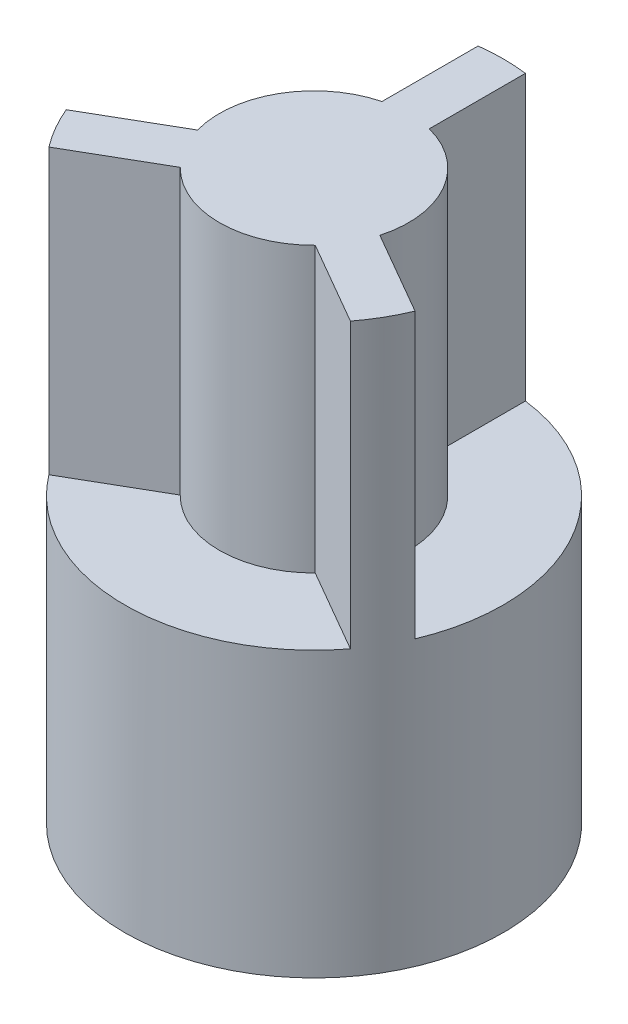
ISO-10303-21;
HEADER;
FILE_DESCRIPTION(('STEP AP214'),'2;1');
FILE_NAME('part.step','',(''),(''),'','','');
FILE_SCHEMA(('AUTOMOTIVE_DESIGN { 1 0 10303 214 1 1 1 1 }'));
ENDSEC;
DATA;
#1=APPLICATION_CONTEXT('core data for automotive mechanical design processes');
#2=APPLICATION_PROTOCOL_DEFINITION('international standard','automotive_design',2000,#1);
#3=PRODUCT_CONTEXT('',#1,'mechanical');
#4=PRODUCT('Part','Part','',(#3));
#5=PRODUCT_RELATED_PRODUCT_CATEGORY('part','',(#4));
#6=PRODUCT_DEFINITION_FORMATION('','',#4);
#7=PRODUCT_DEFINITION_CONTEXT('part definition',#1,'design');
#8=PRODUCT_DEFINITION('design','',#6,#7);
#9=PRODUCT_DEFINITION_SHAPE('','',#8);
#10=(LENGTH_UNIT() NAMED_UNIT(*) SI_UNIT(.MILLI.,.METRE.));
#11=(NAMED_UNIT(*) PLANE_ANGLE_UNIT() SI_UNIT($,.RADIAN.));
#12=(NAMED_UNIT(*) SI_UNIT($,.STERADIAN.) SOLID_ANGLE_UNIT());
#13=UNCERTAINTY_MEASURE_WITH_UNIT(LENGTH_MEASURE(1.E-05),#10,'distance_accuracy_value','');
#14=(GEOMETRIC_REPRESENTATION_CONTEXT(3) GLOBAL_UNCERTAINTY_ASSIGNED_CONTEXT((#13)) GLOBAL_UNIT_ASSIGNED_CONTEXT((#10,
#11,#12)) REPRESENTATION_CONTEXT('',''));
#15=CARTESIAN_POINT('',(0.,0.,0.));
#16=DIRECTION('',(0.,0.,1.));
#17=DIRECTION('',(1.,0.,0.));
#18=AXIS2_PLACEMENT_3D('',#15,#16,#17);
#19=CARTESIAN_POINT('',(0.,6.,0.));
#20=DIRECTION('',(0.,1.,0.));
#21=DIRECTION('',(0.,0.,1.));
#22=AXIS2_PLACEMENT_3D('',#19,#20,#21);
#23=PLANE('',#22);
#24=DIRECTION('',(0.,0.,-1.));
#25=VECTOR('',#24,1.);
#26=CARTESIAN_POINT('',(0.499999999999999,6.,-3.96862696659689));
#27=LINE('',#26,#25);
#28=CARTESIAN_POINT('',(0.5,6.,-1.93649167310371));
#29=VERTEX_POINT('',#28);
#30=CARTESIAN_POINT('',(0.499999999999999,6.,-3.96862696659689));
#31=VERTEX_POINT('',#30);
#32=EDGE_CURVE('E156',#29,#31,#27,.T.);
#33=ORIENTED_EDGE('',*,*,#32,.F.);
#34=CARTESIAN_POINT('',(0.,6.,0.));
#35=DIRECTION('',(0.,1.,0.));
#36=DIRECTION('',(0.,0.,1.));
#37=AXIS2_PLACEMENT_3D('',#34,#35,#36);
#38=CIRCLE('',#37,2.);
#39=CARTESIAN_POINT('',(1.92705098312484,6.,0.535233134659639));
#40=VERTEX_POINT('',#39);
#41=EDGE_CURVE('E11',#40,#29,#38,.T.);
#42=ORIENTED_EDGE('',*,*,#41,.F.);
#43=DIRECTION('',(-0.86602540378444,0.,-0.499999999999998));
#44=VECTOR('',#43,1.);
#45=CARTESIAN_POINT('',(0.500000000000001,6.,-0.288675134594803));
#46=LINE('',#45,#44);
#47=CARTESIAN_POINT('',(3.68693177121688,6.,1.55130078140622));
#48=VERTEX_POINT('',#47);
#49=EDGE_CURVE('E198',#48,#40,#46,.T.);
#50=ORIENTED_EDGE('',*,*,#49,.F.);
#51=CARTESIAN_POINT('',(0.,6.,0.));
#52=DIRECTION('',(0.,1.,0.));
#53=DIRECTION('',(0.,0.,1.));
#54=AXIS2_PLACEMENT_3D('',#51,#52,#53);
#55=CIRCLE('',#54,4.);
#56=EDGE_CURVE('E190',#48,#31,#55,.T.);
#57=ORIENTED_EDGE('',*,*,#56,.T.);
#58=EDGE_LOOP('',(#33,#42,#50,#57));
#59=FACE_BOUND('',#58,.T.);
#60=ADVANCED_FACE('F45',(#59),#23,.T.);
#61=DIRECTION('',(0.866025403784436,0.,0.500000000000004));
#62=VECTOR('',#61,1.);
#63=CARTESIAN_POINT('',(0.,6.,0.577350269189619));
#64=LINE('',#63,#62);
#65=CARTESIAN_POINT('',(1.42705098312485,6.,1.40125853844407));
#66=VERTEX_POINT('',#65);
#67=CARTESIAN_POINT('',(3.18693177121688,6.,2.41732618519066));
#68=VERTEX_POINT('',#67);
#69=EDGE_CURVE('E229',#66,#68,#64,.T.);
#70=ORIENTED_EDGE('',*,*,#69,.F.);
#71=CARTESIAN_POINT('',(-1.42705098312484,6.,1.40125853844408));
#72=VERTEX_POINT('',#71);
#73=EDGE_CURVE('E52',#72,#66,#38,.T.);
#74=ORIENTED_EDGE('',*,*,#73,.F.);
#75=DIRECTION('',(0.866025403784439,0.,-0.499999999999998));
#76=VECTOR('',#75,1.);
#77=CARTESIAN_POINT('',(-3.18693177121688,6.,2.41732618519066));
#78=LINE('',#77,#76);
#79=CARTESIAN_POINT('',(-3.18693177121688,6.,2.41732618519066));
#80=VERTEX_POINT('',#79);
#81=EDGE_CURVE('E58',#80,#72,#78,.T.);
#82=ORIENTED_EDGE('',*,*,#81,.F.);
#83=EDGE_CURVE('E189',#80,#68,#55,.T.);
#84=ORIENTED_EDGE('',*,*,#83,.T.);
#85=EDGE_LOOP('',(#70,#74,#82,#84));
#86=FACE_BOUND('',#85,.T.);
#87=ADVANCED_FACE('F264',(#86),#23,.T.);
#88=CARTESIAN_POINT('',(0.,12.,0.));
#89=DIRECTION('',(0.,-1.,0.));
#90=DIRECTION('',(0.,0.,-1.));
#91=AXIS2_PLACEMENT_3D('',#88,#89,#90);
#92=CYLINDRICAL_SURFACE('',#91,2.);
#93=DIRECTION('',(0.,-1.,0.));
#94=VECTOR('',#93,1.);
#95=CARTESIAN_POINT('',(-0.5,12.,-1.93649167310371));
#96=LINE('',#95,#94);
#97=CARTESIAN_POINT('',(-0.5,6.,-1.93649167310371));
#98=VERTEX_POINT('',#97);
#99=CARTESIAN_POINT('',(-0.5,12.,-1.93649167310371));
#100=VERTEX_POINT('',#99);
#101=EDGE_CURVE('E143',#98,#100,#96,.F.);
#102=ORIENTED_EDGE('',*,*,#101,.F.);
#103=CARTESIAN_POINT('',(-1.92705098312484,6.,0.535233134659638));
#104=VERTEX_POINT('',#103);
#105=EDGE_CURVE('E51',#98,#104,#38,.T.);
#106=ORIENTED_EDGE('',*,*,#105,.T.);
#107=DIRECTION('',(0.,-1.,0.));
#108=VECTOR('',#107,1.);
#109=CARTESIAN_POINT('',(-1.92705098312484,12.,0.535233134659638));
#110=LINE('',#109,#108);
#111=CARTESIAN_POINT('',(-1.92705098312484,12.,0.535233134659638));
#112=VERTEX_POINT('',#111);
#113=EDGE_CURVE('E176',#112,#104,#110,.T.);
#114=ORIENTED_EDGE('',*,*,#113,.F.);
#115=CARTESIAN_POINT('',(0.,12.,0.));
#116=DIRECTION('',(0.,1.,0.));
#117=DIRECTION('',(0.,0.,1.));
#118=AXIS2_PLACEMENT_3D('',#115,#116,#117);
#119=CIRCLE('',#118,2.);
#120=EDGE_CURVE('E184',#100,#112,#119,.T.);
#121=ORIENTED_EDGE('',*,*,#120,.F.);
#122=EDGE_LOOP('',(#102,#106,#114,#121));
#123=FACE_BOUND('',#122,.T.);
#124=ADVANCED_FACE('F248',(#123),#92,.T.);
#125=DIRECTION('',(0.,-1.,0.));
#126=VECTOR('',#125,1.);
#127=CARTESIAN_POINT('',(-1.42705098312484,12.,1.40125853844408));
#128=LINE('',#127,#126);
#129=CARTESIAN_POINT('',(-1.42705098312484,12.,1.40125853844408));
#130=VERTEX_POINT('',#129);
#131=EDGE_CURVE('E177',#72,#130,#128,.F.);
#132=ORIENTED_EDGE('',*,*,#131,.F.);
#133=ORIENTED_EDGE('',*,*,#73,.T.);
#134=DIRECTION('',(0.,-1.,0.));
#135=VECTOR('',#134,1.);
#136=CARTESIAN_POINT('',(1.42705098312485,12.,1.40125853844407));
#137=LINE('',#136,#135);
#138=CARTESIAN_POINT('',(1.42705098312485,12.,1.40125853844407));
#139=VERTEX_POINT('',#138);
#140=EDGE_CURVE('E174',#139,#66,#137,.T.);
#141=ORIENTED_EDGE('',*,*,#140,.F.);
#142=EDGE_CURVE('E181',#130,#139,#119,.T.);
#143=ORIENTED_EDGE('',*,*,#142,.F.);
#144=EDGE_LOOP('',(#132,#133,#141,#143));
#145=FACE_BOUND('',#144,.T.);
#146=ADVANCED_FACE('F285',(#145),#92,.T.);
#147=DIRECTION('',(0.,-1.,0.));
#148=VECTOR('',#147,1.);
#149=CARTESIAN_POINT('',(1.92705098312484,12.,0.535233134659639));
#150=LINE('',#149,#148);
#151=CARTESIAN_POINT('',(1.92705098312484,12.,0.535233134659639));
#152=VERTEX_POINT('',#151);
#153=EDGE_CURVE('E164',#40,#152,#150,.F.);
#154=ORIENTED_EDGE('',*,*,#153,.F.);
#155=ORIENTED_EDGE('',*,*,#41,.T.);
#156=DIRECTION('',(0.,-1.,0.));
#157=VECTOR('',#156,1.);
#158=CARTESIAN_POINT('',(0.5,12.,-1.93649167310371));
#159=LINE('',#158,#157);
#160=CARTESIAN_POINT('',(0.5,12.,-1.93649167310371));
#161=VERTEX_POINT('',#160);
#162=EDGE_CURVE('E161',#161,#29,#159,.T.);
#163=ORIENTED_EDGE('',*,*,#162,.F.);
#164=EDGE_CURVE('E183',#152,#161,#119,.T.);
#165=ORIENTED_EDGE('',*,*,#164,.F.);
#166=EDGE_LOOP('',(#154,#155,#163,#165));
#167=FACE_BOUND('',#166,.T.);
#168=ADVANCED_FACE('F251',(#167),#92,.T.);
#169=CARTESIAN_POINT('',(0.,6.,0.));
#170=DIRECTION('',(0.,-1.,0.));
#171=DIRECTION('',(0.,0.,-1.));
#172=AXIS2_PLACEMENT_3D('',#169,#170,#171);
#173=CYLINDRICAL_SURFACE('',#172,4.);
#174=ORIENTED_EDGE('',*,*,#56,.F.);
#175=DIRECTION('',(0.,-1.,0.));
#176=VECTOR('',#175,1.);
#177=CARTESIAN_POINT('',(3.68693177121688,12.,1.55130078140622));
#178=LINE('',#177,#176);
#179=CARTESIAN_POINT('',(3.68693177121688,12.,1.55130078140622));
#180=VERTEX_POINT('',#179);
#181=EDGE_CURVE('E201',#180,#48,#178,.T.);
#182=ORIENTED_EDGE('',*,*,#181,.F.);
#183=CARTESIAN_POINT('',(0.,12.,0.));
#184=DIRECTION('',(0.,1.,0.));
#185=DIRECTION('',(0.,0.,1.));
#186=AXIS2_PLACEMENT_3D('',#183,#184,#185);
#187=CIRCLE('',#186,4.);
#188=CARTESIAN_POINT('',(3.18693177121688,12.,2.41732618519066));
#189=VERTEX_POINT('',#188);
#190=EDGE_CURVE('E224',#189,#180,#187,.T.);
#191=ORIENTED_EDGE('',*,*,#190,.F.);
#192=DIRECTION('',(0.,-1.,0.));
#193=VECTOR('',#192,1.);
#194=CARTESIAN_POINT('',(3.18693177121688,12.,2.41732618519066));
#195=LINE('',#194,#193);
#196=EDGE_CURVE('E202',#189,#68,#195,.T.);
#197=ORIENTED_EDGE('',*,*,#196,.T.);
#198=ORIENTED_EDGE('',*,*,#83,.F.);
#199=DIRECTION('',(0.,-1.,0.));
#200=VECTOR('',#199,1.);
#201=CARTESIAN_POINT('',(-3.18693177121688,12.,2.41732618519066));
#202=LINE('',#201,#200);
#203=CARTESIAN_POINT('',(-3.18693177121688,12.,2.41732618519066));
#204=VERTEX_POINT('',#203);
#205=EDGE_CURVE('E170',#204,#80,#202,.T.);
#206=ORIENTED_EDGE('',*,*,#205,.F.);
#207=CARTESIAN_POINT('',(0.,12.,0.));
#208=DIRECTION('',(0.,1.,0.));
#209=DIRECTION('',(0.,0.,1.));
#210=AXIS2_PLACEMENT_3D('',#207,#208,#209);
#211=CIRCLE('',#210,4.);
#212=CARTESIAN_POINT('',(-3.68693177121688,12.,1.55130078140622));
#213=VERTEX_POINT('',#212);
#214=EDGE_CURVE('E219',#213,#204,#211,.T.);
#215=ORIENTED_EDGE('',*,*,#214,.F.);
#216=DIRECTION('',(0.,-1.,0.));
#217=VECTOR('',#216,1.);
#218=CARTESIAN_POINT('',(-3.68693177121688,12.,1.55130078140622));
#219=LINE('',#218,#217);
#220=CARTESIAN_POINT('',(-3.68693177121688,6.,1.55130078140622));
#221=VERTEX_POINT('',#220);
#222=EDGE_CURVE('E165',#213,#221,#219,.T.);
#223=ORIENTED_EDGE('',*,*,#222,.T.);
#224=CARTESIAN_POINT('',(-0.500000000000001,6.,-3.96862696659689));
#225=VERTEX_POINT('',#224);
#226=EDGE_CURVE('E69',#225,#221,#55,.T.);
#227=ORIENTED_EDGE('',*,*,#226,.F.);
#228=DIRECTION('',(0.,-1.,0.));
#229=VECTOR('',#228,1.);
#230=CARTESIAN_POINT('',(-0.500000000000001,12.,-3.96862696659689));
#231=LINE('',#230,#229);
#232=CARTESIAN_POINT('',(-0.500000000000001,12.,-3.96862696659689));
#233=VERTEX_POINT('',#232);
#234=EDGE_CURVE('E138',#233,#225,#231,.T.);
#235=ORIENTED_EDGE('',*,*,#234,.F.);
#236=CARTESIAN_POINT('',(0.,12.,0.));
#237=DIRECTION('',(0.,1.,0.));
#238=DIRECTION('',(0.,0.,1.));
#239=AXIS2_PLACEMENT_3D('',#236,#237,#238);
#240=CIRCLE('',#239,4.);
#241=CARTESIAN_POINT('',(0.499999999999999,12.,-3.96862696659689));
#242=VERTEX_POINT('',#241);
#243=EDGE_CURVE('E144',#242,#233,#240,.T.);
#244=ORIENTED_EDGE('',*,*,#243,.F.);
#245=DIRECTION('',(0.,-1.,0.));
#246=VECTOR('',#245,1.);
#247=CARTESIAN_POINT('',(0.499999999999999,12.,-3.96862696659689));
#248=LINE('',#247,#246);
#249=EDGE_CURVE('E203',#242,#31,#248,.T.);
#250=ORIENTED_EDGE('',*,*,#249,.T.);
#251=EDGE_LOOP('',(#174,#182,#191,#197,#198,#206,#215,#223,#227,#235,#244,#250));
#252=FACE_BOUND('',#251,.T.);
#253=CARTESIAN_POINT('',(0.,0.,0.));
#254=DIRECTION('',(0.,1.,0.));
#255=DIRECTION('',(0.,0.,1.));
#256=AXIS2_PLACEMENT_3D('',#253,#254,#255);
#257=CIRCLE('',#256,4.);
#258=CARTESIAN_POINT('',(0.,0.,4.));
#259=VERTEX_POINT('',#258);
#260=EDGE_CURVE('E46',#259,#259,#257,.T.);
#261=ORIENTED_EDGE('',*,*,#260,.T.);
#262=EDGE_LOOP('',(#261));
#263=FACE_BOUND('',#262,.T.);
#264=ADVANCED_FACE('F42',(#252,#263),#173,.T.);
#265=DIRECTION('',(-0.86602540378444,0.,0.499999999999998));
#266=VECTOR('',#265,1.);
#267=CARTESIAN_POINT('',(-0.5,6.,-0.288675134594805));
#268=LINE('',#267,#266);
#269=EDGE_CURVE('E228',#104,#221,#268,.T.);
#270=ORIENTED_EDGE('',*,*,#269,.F.);
#271=ORIENTED_EDGE('',*,*,#105,.F.);
#272=DIRECTION('',(0.,0.,1.));
#273=VECTOR('',#272,1.);
#274=CARTESIAN_POINT('',(-0.500000000000001,6.,-3.96862696659689));
#275=LINE('',#274,#273);
#276=EDGE_CURVE('E231',#225,#98,#275,.T.);
#277=ORIENTED_EDGE('',*,*,#276,.F.);
#278=ORIENTED_EDGE('',*,*,#226,.T.);
#279=EDGE_LOOP('',(#270,#271,#277,#278));
#280=FACE_BOUND('',#279,.T.);
#281=ADVANCED_FACE('F249',(#280),#23,.T.);
#282=CARTESIAN_POINT('',(0.,0.,0.));
#283=DIRECTION('',(0.,1.,0.));
#284=DIRECTION('',(0.,0.,1.));
#285=AXIS2_PLACEMENT_3D('',#282,#283,#284);
#286=PLANE('',#285);
#287=ORIENTED_EDGE('',*,*,#260,.F.);
#288=EDGE_LOOP('',(#287));
#289=FACE_BOUND('',#288,.T.);
#290=ADVANCED_FACE('F272',(#289),#286,.F.);
#291=CARTESIAN_POINT('',(0.,12.,0.));
#292=DIRECTION('',(0.,1.,0.));
#293=DIRECTION('',(0.,0.,1.));
#294=AXIS2_PLACEMENT_3D('',#291,#292,#293);
#295=PLANE('',#294);
#296=ORIENTED_EDGE('',*,*,#142,.T.);
#297=DIRECTION('',(0.866025403784436,0.,0.500000000000004));
#298=VECTOR('',#297,1.);
#299=CARTESIAN_POINT('',(0.,12.,0.577350269189619));
#300=LINE('',#299,#298);
#301=EDGE_CURVE('E230',#139,#189,#300,.T.);
#302=ORIENTED_EDGE('',*,*,#301,.T.);
#303=ORIENTED_EDGE('',*,*,#190,.T.);
#304=DIRECTION('',(-0.86602540378444,0.,-0.499999999999998));
#305=VECTOR('',#304,1.);
#306=CARTESIAN_POINT('',(0.500000000000001,12.,-0.288675134594803));
#307=LINE('',#306,#305);
#308=EDGE_CURVE('E210',#180,#152,#307,.T.);
#309=ORIENTED_EDGE('',*,*,#308,.T.);
#310=ORIENTED_EDGE('',*,*,#164,.T.);
#311=DIRECTION('',(0.,0.,-1.));
#312=VECTOR('',#311,1.);
#313=CARTESIAN_POINT('',(0.499999999999999,12.,-3.96862696659689));
#314=LINE('',#313,#312);
#315=EDGE_CURVE('E155',#161,#242,#314,.T.);
#316=ORIENTED_EDGE('',*,*,#315,.T.);
#317=ORIENTED_EDGE('',*,*,#243,.T.);
#318=DIRECTION('',(0.,0.,1.));
#319=VECTOR('',#318,1.);
#320=CARTESIAN_POINT('',(-0.500000000000001,12.,-3.96862696659689));
#321=LINE('',#320,#319);
#322=EDGE_CURVE('E133',#233,#100,#321,.T.);
#323=ORIENTED_EDGE('',*,*,#322,.T.);
#324=ORIENTED_EDGE('',*,*,#120,.T.);
#325=DIRECTION('',(-0.86602540378444,0.,0.499999999999998));
#326=VECTOR('',#325,1.);
#327=CARTESIAN_POINT('',(-0.5,12.,-0.288675134594805));
#328=LINE('',#327,#326);
#329=EDGE_CURVE('E145',#112,#213,#328,.T.);
#330=ORIENTED_EDGE('',*,*,#329,.T.);
#331=ORIENTED_EDGE('',*,*,#214,.T.);
#332=DIRECTION('',(0.866025403784439,0.,-0.499999999999998));
#333=VECTOR('',#332,1.);
#334=CARTESIAN_POINT('',(-3.18693177121688,12.,2.41732618519066));
#335=LINE('',#334,#333);
#336=EDGE_CURVE('E217',#204,#130,#335,.T.);
#337=ORIENTED_EDGE('',*,*,#336,.T.);
#338=EDGE_LOOP('',(#296,#302,#303,#309,#310,#316,#317,#323,#324,#330,#331,#337));
#339=FACE_BOUND('',#338,.T.);
#340=ADVANCED_FACE('F149',(#339),#295,.T.);
#341=CARTESIAN_POINT('',(-0.500000000000001,12.,-3.96862696659689));
#342=DIRECTION('',(1.,0.,0.));
#343=DIRECTION('',(0.,0.,-1.));
#344=AXIS2_PLACEMENT_3D('',#341,#342,#343);
#345=PLANE('',#344);
#346=ORIENTED_EDGE('',*,*,#276,.T.);
#347=ORIENTED_EDGE('',*,*,#101,.T.);
#348=ORIENTED_EDGE('',*,*,#322,.F.);
#349=ORIENTED_EDGE('',*,*,#234,.T.);
#350=EDGE_LOOP('',(#346,#347,#348,#349));
#351=FACE_BOUND('',#350,.T.);
#352=ADVANCED_FACE('F139',(#351),#345,.F.);
#353=CARTESIAN_POINT('',(0.499999999999999,12.,-3.96862696659689));
#354=DIRECTION('',(-1.,0.,0.));
#355=DIRECTION('',(0.,0.,1.));
#356=AXIS2_PLACEMENT_3D('',#353,#354,#355);
#357=PLANE('',#356);
#358=ORIENTED_EDGE('',*,*,#315,.F.);
#359=ORIENTED_EDGE('',*,*,#162,.T.);
#360=ORIENTED_EDGE('',*,*,#32,.T.);
#361=ORIENTED_EDGE('',*,*,#249,.F.);
#362=EDGE_LOOP('',(#358,#359,#360,#361));
#363=FACE_BOUND('',#362,.T.);
#364=ADVANCED_FACE('F199',(#363),#357,.F.);
#365=CARTESIAN_POINT('',(0.500000000000001,12.,-0.288675134594803));
#366=DIRECTION('',(-0.499999999999998,0.,0.86602540378444));
#367=DIRECTION('',(0.86602540378444,0.,0.499999999999998));
#368=AXIS2_PLACEMENT_3D('',#365,#366,#367);
#369=PLANE('',#368);
#370=ORIENTED_EDGE('',*,*,#49,.T.);
#371=ORIENTED_EDGE('',*,*,#153,.T.);
#372=ORIENTED_EDGE('',*,*,#308,.F.);
#373=ORIENTED_EDGE('',*,*,#181,.T.);
#374=EDGE_LOOP('',(#370,#371,#372,#373));
#375=FACE_BOUND('',#374,.T.);
#376=ADVANCED_FACE('F254',(#375),#369,.F.);
#377=CARTESIAN_POINT('',(0.,12.,0.577350269189619));
#378=DIRECTION('',(0.500000000000004,0.,-0.866025403784436));
#379=DIRECTION('',(-0.866025403784437,0.,-0.500000000000004));
#380=AXIS2_PLACEMENT_3D('',#377,#378,#379);
#381=PLANE('',#380);
#382=ORIENTED_EDGE('',*,*,#301,.F.);
#383=ORIENTED_EDGE('',*,*,#140,.T.);
#384=ORIENTED_EDGE('',*,*,#69,.T.);
#385=ORIENTED_EDGE('',*,*,#196,.F.);
#386=EDGE_LOOP('',(#382,#383,#384,#385));
#387=FACE_BOUND('',#386,.T.);
#388=ADVANCED_FACE('F227',(#387),#381,.F.);
#389=CARTESIAN_POINT('',(-0.5,12.,-0.288675134594805));
#390=DIRECTION('',(0.499999999999998,0.,0.86602540378444));
#391=DIRECTION('',(0.86602540378444,0.,-0.499999999999998));
#392=AXIS2_PLACEMENT_3D('',#389,#390,#391);
#393=PLANE('',#392);
#394=ORIENTED_EDGE('',*,*,#329,.F.);
#395=ORIENTED_EDGE('',*,*,#113,.T.);
#396=ORIENTED_EDGE('',*,*,#269,.T.);
#397=ORIENTED_EDGE('',*,*,#222,.F.);
#398=EDGE_LOOP('',(#394,#395,#396,#397));
#399=FACE_BOUND('',#398,.T.);
#400=ADVANCED_FACE('F243',(#399),#393,.F.);
#401=CARTESIAN_POINT('',(-3.18693177121688,12.,2.41732618519066));
#402=DIRECTION('',(-0.499999999999998,0.,-0.86602540378444));
#403=DIRECTION('',(-0.86602540378444,0.,0.499999999999998));
#404=AXIS2_PLACEMENT_3D('',#401,#402,#403);
#405=PLANE('',#404);
#406=ORIENTED_EDGE('',*,*,#81,.T.);
#407=ORIENTED_EDGE('',*,*,#131,.T.);
#408=ORIENTED_EDGE('',*,*,#336,.F.);
#409=ORIENTED_EDGE('',*,*,#205,.T.);
#410=EDGE_LOOP('',(#406,#407,#408,#409));
#411=FACE_BOUND('',#410,.T.);
#412=ADVANCED_FACE('F216',(#411),#405,.F.);
#413=CLOSED_SHELL('',(#60,#87,#124,#146,#168,#264,#281,#290,#340,#352,#364,#376,#388,#400,#412));
#414=MANIFOLD_SOLID_BREP('B2',#413);
#415=ADVANCED_BREP_SHAPE_REPRESENTATION('',(#18,#414),#14);
#416=SHAPE_DEFINITION_REPRESENTATION(#9,#415);
ENDSEC;
END-ISO-10303-21;
